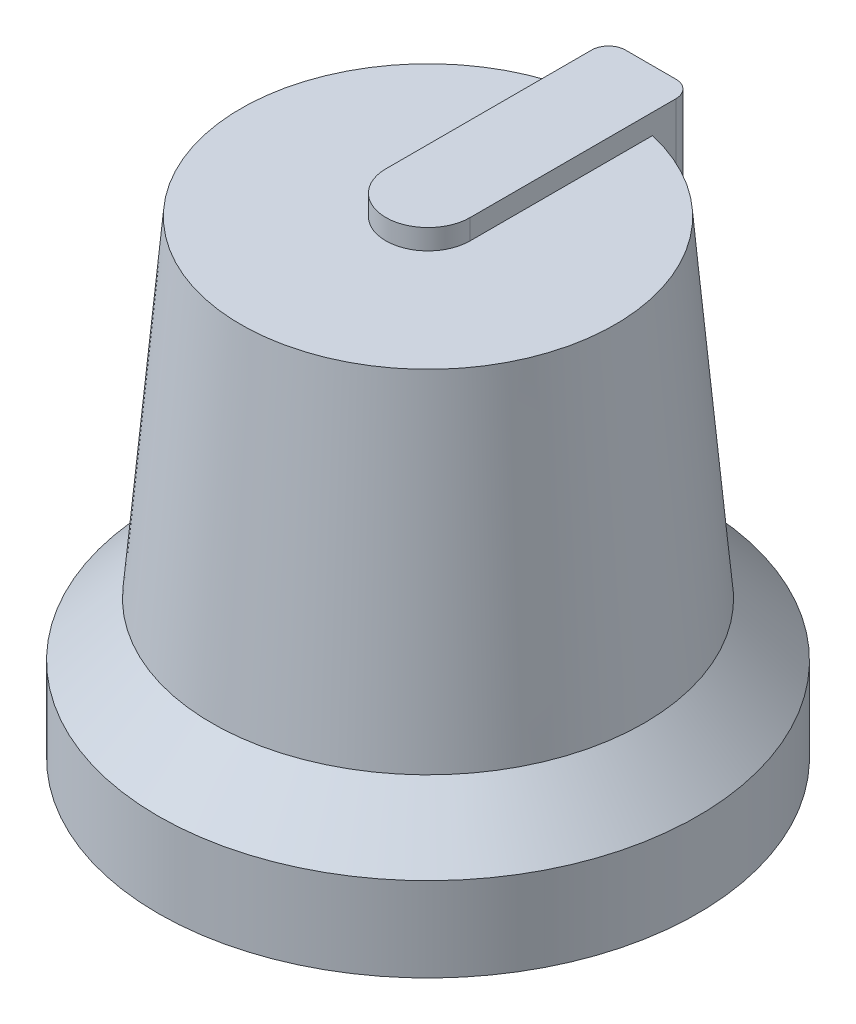
ISO-10303-21;
HEADER;
FILE_DESCRIPTION(('STEP AP214'),'2;1');
FILE_NAME('part.step','',(''),(''),'','','');
FILE_SCHEMA(('AUTOMOTIVE_DESIGN { 1 0 10303 214 1 1 1 1 }'));
ENDSEC;
DATA;
#1=APPLICATION_CONTEXT('core data for automotive mechanical design processes');
#2=APPLICATION_PROTOCOL_DEFINITION('international standard','automotive_design',2000,#1);
#3=PRODUCT_CONTEXT('',#1,'mechanical');
#4=PRODUCT('Part','Part','',(#3));
#5=PRODUCT_RELATED_PRODUCT_CATEGORY('part','',(#4));
#6=PRODUCT_DEFINITION_FORMATION('','',#4);
#7=PRODUCT_DEFINITION_CONTEXT('part definition',#1,'design');
#8=PRODUCT_DEFINITION('design','',#6,#7);
#9=PRODUCT_DEFINITION_SHAPE('','',#8);
#10=(LENGTH_UNIT() NAMED_UNIT(*) SI_UNIT(.MILLI.,.METRE.));
#11=(NAMED_UNIT(*) PLANE_ANGLE_UNIT() SI_UNIT($,.RADIAN.));
#12=(NAMED_UNIT(*) SI_UNIT($,.STERADIAN.) SOLID_ANGLE_UNIT());
#13=UNCERTAINTY_MEASURE_WITH_UNIT(LENGTH_MEASURE(1.E-05),#10,'distance_accuracy_value','');
#14=(GEOMETRIC_REPRESENTATION_CONTEXT(3) GLOBAL_UNCERTAINTY_ASSIGNED_CONTEXT((#13)) GLOBAL_UNIT_ASSIGNED_CONTEXT((#10,
#11,#12)) REPRESENTATION_CONTEXT('',''));
#15=CARTESIAN_POINT('',(0.,0.,0.));
#16=DIRECTION('',(0.,0.,1.));
#17=DIRECTION('',(1.,0.,0.));
#18=AXIS2_PLACEMENT_3D('',#15,#16,#17);
#19=CARTESIAN_POINT('',(0.,13.9,0.));
#20=DIRECTION('',(0.,1.,0.));
#21=DIRECTION('',(0.,0.,1.));
#22=AXIS2_PLACEMENT_3D('',#19,#20,#21);
#23=PLANE('',#22);
#24=CARTESIAN_POINT('',(0.,13.9,0.));
#25=DIRECTION('',(0.,-1.,0.));
#26=DIRECTION('',(0.,0.,-1.));
#27=AXIS2_PLACEMENT_3D('',#24,#25,#26);
#28=CIRCLE('',#27,5.55);
#29=CARTESIAN_POINT('',(1.25000004,13.9,-5.40740232459172));
#30=VERTEX_POINT('',#29);
#31=CARTESIAN_POINT('',(-1.25000004,13.9,-5.40740232459172));
#32=VERTEX_POINT('',#31);
#33=EDGE_CURVE('E11',#30,#32,#28,.T.);
#34=ORIENTED_EDGE('',*,*,#33,.F.);
#35=DIRECTION('',(0.,0.,-1.));
#36=VECTOR('',#35,1.);
#37=CARTESIAN_POINT('',(1.25000004,13.9,0.));
#38=LINE('',#37,#36);
#39=CARTESIAN_POINT('',(1.25000004,13.9,0.));
#40=VERTEX_POINT('',#39);
#41=EDGE_CURVE('E66',#40,#30,#38,.T.);
#42=ORIENTED_EDGE('',*,*,#41,.F.);
#43=CARTESIAN_POINT('',(0.,13.9,0.));
#44=DIRECTION('',(0.,1.,0.));
#45=DIRECTION('',(0.,0.,1.));
#46=AXIS2_PLACEMENT_3D('',#43,#44,#45);
#47=CIRCLE('',#46,1.25000004);
#48=CARTESIAN_POINT('',(-1.25000004,13.9,0.));
#49=VERTEX_POINT('',#48);
#50=EDGE_CURVE('E169',#49,#40,#47,.T.);
#51=ORIENTED_EDGE('',*,*,#50,.F.);
#52=DIRECTION('',(0.,0.,1.));
#53=VECTOR('',#52,1.);
#54=CARTESIAN_POINT('',(-1.25000004,13.9,-6.104));
#55=LINE('',#54,#53);
#56=EDGE_CURVE('E163',#32,#49,#55,.T.);
#57=ORIENTED_EDGE('',*,*,#56,.F.);
#58=EDGE_LOOP('',(#34,#42,#51,#57));
#59=FACE_BOUND('',#58,.T.);
#60=ADVANCED_FACE('F43',(#59),#23,.T.);
#61=CARTESIAN_POINT('',(0.,4.0919026731409,0.));
#62=DIRECTION('',(0.,-1.,0.));
#63=DIRECTION('',(0.,0.,-1.));
#64=AXIS2_PLACEMENT_3D('',#61,#62,#63);
#65=CONICAL_SURFACE('',#64,6.4080973268591,0.0872664625997172);
#66=CARTESIAN_POINT('',(1.13287773589336,2.75947851711593,-6.42556596521925));
#67=CARTESIAN_POINT('',(1.14010249654289,2.84208286496006,-6.41695324963921));
#68=CARTESIAN_POINT('',(1.14678798875751,2.92473970483003,-6.40841472831424));
#69=CARTESIAN_POINT('',(1.15923515555885,3.09013409168479,-6.39146939860238));
#70=CARTESIAN_POINT('',(1.16499685881051,3.17287163608516,-6.38306258613591));
#71=CARTESIAN_POINT('',(1.1811277455034,3.42115784202162,-6.35801579928834));
#72=CARTESIAN_POINT('',(1.19034427376621,3.58679881601859,-6.34154753027921));
#73=CARTESIAN_POINT('',(1.20385174246225,3.86554456774386,-6.31416718765233));
#74=CARTESIAN_POINT('',(1.20877708805953,3.97861011857928,-6.30315315834273));
#75=CARTESIAN_POINT('',(1.21973414088708,4.25748143967847,-6.27619321910208));
#76=CARTESIAN_POINT('',(1.22521230379919,4.42331823099242,-6.26034011202074));
#77=CARTESIAN_POINT('',(1.23441170376236,4.75507086490616,-6.22894607315379));
#78=CARTESIAN_POINT('',(1.23813291175039,4.92098670876817,-6.21340514653624));
#79=CARTESIAN_POINT('',(1.24721542557524,5.43188623262331,-6.16600191508051));
#80=CARTESIAN_POINT('',(1.25001555976719,5.77696136775237,-6.13461806319985));
#81=CARTESIAN_POINT('',(1.24998503059938,6.45411214251673,-6.07415123156932));
#82=CARTESIAN_POINT('',(1.24736397916437,6.78618424223582,-6.04502613216578));
#83=CARTESIAN_POINT('',(1.2410579221894,7.19716504213283,-6.009613143888));
#84=CARTESIAN_POINT('',(1.23970750086682,7.27607088336374,-6.00284293916313));
#85=CARTESIAN_POINT('',(1.23821914878362,7.35497634587432,-5.99610142809781));
#86=B_SPLINE_CURVE_WITH_KNOTS('',3,(#66,#67,#68,#69,#70,#71,#72,#73,#74,#75,#76,#77,#78,#79,#80,
#81,#82,#83,#84,#85),.UNSPECIFIED.,.F.,.F.,(4,2,2,2,2,2,2,2,2,4),(0.,0.250091906154019,
0.500176050514862,1.00028763288696,1.34140674154141,1.84144235656785,2.34148624275007,
3.38095651390291,4.38098734517701,4.61860858160698),.UNSPECIFIED.);
#87=CARTESIAN_POINT('',(1.21322843086549,4.0919026731409,-6.29220057889435));
#88=VERTEX_POINT('',#87);
#89=CARTESIAN_POINT('',(1.25000004,6.11984443019012,-6.104));
#90=VERTEX_POINT('',#89);
#91=EDGE_CURVE('E110',#88,#90,#86,.T.);
#92=ORIENTED_EDGE('',*,*,#91,.T.);
#93=CARTESIAN_POINT('',(1.25000004,-7.46068189339517,-7.31275277575942));
#94=CARTESIAN_POINT('',(1.25000004,-5.19490274002375,-7.11163661786975));
#95=CARTESIAN_POINT('',(1.25000004,-2.9291424416168,-6.91030739249945));
#96=CARTESIAN_POINT('',(1.25000004,1.60232336786873,-6.50703874465845));
#97=CARTESIAN_POINT('',(1.25000004,3.86802887895862,-6.30509932231488));
#98=CARTESIAN_POINT('',(1.25000004,7.74370757222152,-5.95898024591337));
#99=CARTESIAN_POINT('',(1.25000004,9.35369830843248,-5.81499720478357));
#100=CARTESIAN_POINT('',(1.25000004,12.5736345362197,-5.52652648435787));
#101=CARTESIAN_POINT('',(1.25000004,14.183580027797,-5.38203880507492));
#102=CARTESIAN_POINT('',(1.25000004,17.4034145159577,-5.09242958768715));
#103=CARTESIAN_POINT('',(1.25000004,19.0133035125242,-4.94730804939491));
#104=CARTESIAN_POINT('',(1.25000004,22.233005689752,-4.65622484605253));
#105=CARTESIAN_POINT('',(1.25000004,23.842818870406,-4.51026318092195));
#106=CARTESIAN_POINT('',(1.25000004,25.4525845665361,-4.3637783110485));
#107=B_SPLINE_CURVE_WITH_KNOTS('',3,(#93,#94,#95,#96,#97,#98,#99,#100,#101,#102,#103,#104,#105,
#106),.UNSPECIFIED.,.F.,.F.,(4,2,2,2,2,2,4),(0.,6.82406235427606,13.6481232869528,
18.4973717797254,23.3466201480801,28.1958699504224,33.0451202171295),.UNSPECIFIED.);
#108=EDGE_CURVE('E121',#90,#30,#107,.T.);
#109=ORIENTED_EDGE('',*,*,#108,.T.);
#110=ORIENTED_EDGE('',*,*,#33,.T.);
#111=CARTESIAN_POINT('',(-1.25000004,25.4525845665361,-4.36377831104848));
#112=CARTESIAN_POINT('',(-1.25000004,24.0665207363569,-4.48991148495176));
#113=CARTESIAN_POINT('',(-1.25000004,22.6804211764974,-4.61565114926747));
#114=CARTESIAN_POINT('',(-1.25000004,19.9081638711375,-4.86648469910314));
#115=CARTESIAN_POINT('',(-1.25000004,18.5220061256478,-4.99157858474114));
#116=CARTESIAN_POINT('',(-1.25000004,15.0862570318947,-5.30100766957549));
#117=CARTESIAN_POINT('',(-1.25000004,13.0366387463785,-5.48504366003264));
#118=CARTESIAN_POINT('',(-1.25000004,8.93732921856495,-5.85230200229592));
#119=CARTESIAN_POINT('',(-1.25000004,6.88763797626408,-6.03552435406263));
#120=CARTESIAN_POINT('',(-1.25000004,2.7881994345329,-6.40135378466173));
#121=CARTESIAN_POINT('',(-1.25000004,0.738452135071536,-6.58396086314601));
#122=CARTESIAN_POINT('',(-1.25000004,-3.36108547558575,-6.94868899243772));
#123=CARTESIAN_POINT('',(-1.25000004,-5.41087578677677,-7.13081004330028));
#124=CARTESIAN_POINT('',(-1.25000004,-7.46068189339517,-7.31275277575942));
#125=B_SPLINE_CURVE_WITH_KNOTS('',3,(#111,#112,#113,#114,#115,#116,#117,#118,#119,#120,#121,
#122,#123,#124),.UNSPECIFIED.,.F.,.F.,(4,2,2,2,2,2,4),(0.,4.17537318414044,8.35074560514845,
14.5243374636698,20.6979296211488,26.8715252709371,33.0451202203383),.UNSPECIFIED.);
#126=CARTESIAN_POINT('',(-1.25000004,6.11984443019012,-6.104));
#127=VERTEX_POINT('',#126);
#128=EDGE_CURVE('E173',#32,#127,#125,.T.);
#129=ORIENTED_EDGE('',*,*,#128,.T.);
#130=CARTESIAN_POINT('',(-1.23802538181554,7.36519706245983,-5.99522837792289));
#131=CARTESIAN_POINT('',(-1.2411805799537,7.19915773013139,-6.0094094258567));
#132=CARTESIAN_POINT('',(-1.24372597930049,7.03311696453166,-6.02371739176339));
#133=CARTESIAN_POINT('',(-1.24756470614474,6.70104499240537,-6.05259002861875));
#134=CARTESIAN_POINT('',(-1.24885804615077,6.53501378579988,-6.06715469700136));
#135=CARTESIAN_POINT('',(-1.24983192657511,6.28668684475427,-6.08913411614203));
#136=CARTESIAN_POINT('',(-1.24999686664072,6.2043840708151,-6.09645087032249));
#137=CARTESIAN_POINT('',(-1.25000632049041,5.95607166338285,-6.11862437839113));
#138=CARTESIAN_POINT('',(-1.24935425938871,5.79007049190831,-6.13358049069972));
#139=CARTESIAN_POINT('',(-1.24664644068078,5.45810155758846,-6.1637658293685));
#140=CARTESIAN_POINT('',(-1.24459065965172,5.29213379534684,-6.17899506028188));
#141=CARTESIAN_POINT('',(-1.23882946460056,4.9536993042354,-6.2103482909902));
#142=CARTESIAN_POINT('',(-1.23506212858186,4.78123467974333,-6.22648387916341));
#143=CARTESIAN_POINT('',(-1.22564209834689,4.43639368011715,-6.2590905109381));
#144=CARTESIAN_POINT('',(-1.21998947354061,4.26401730196806,-6.27556154216875));
#145=CARTESIAN_POINT('',(-1.20834966908922,3.96770489688132,-6.30420729408972));
#146=CARTESIAN_POINT('',(-1.20290072805375,3.84373909599984,-6.31629168411649));
#147=CARTESIAN_POINT('',(-1.19064712579009,3.59589821460663,-6.34067643934778));
#148=CARTESIAN_POINT('',(-1.18384249661927,3.47202313201924,-6.35297679943909));
#149=CARTESIAN_POINT('',(-1.16861132285913,3.22436595377569,-6.37782586285574));
#150=CARTESIAN_POINT('',(-1.1601844080915,3.100583885828,-6.39037462227417));
#151=CARTESIAN_POINT('',(-1.1412007396534,2.85320429384708,-6.41577416467707));
#152=CARTESIAN_POINT('',(-1.13064379278908,2.72960678757871,-6.42862497496406));
#153=CARTESIAN_POINT('',(-1.11876806400668,2.60614441218051,-6.44165388265235));
#154=B_SPLINE_CURVE_WITH_KNOTS('',3,(#130,#131,#132,#133,#134,#135,#136,#137,#138,#139,#140,
#141,#142,#143,#144,#145,#146,#147,#148,#149,#150,#151,#152,#153),.UNSPECIFIED.,.F.,.F.,(4,2,2,
2,2,2,2,2,2,2,2,4),(0.,0.50002111324739,1.00003723103632,1.24791939039897,1.74793763583056,
2.24796422489953,2.76773145054726,3.28747954222814,3.66149077982441,4.03549317438891,
4.40958101138377,4.78370279340043),.UNSPECIFIED.);
#155=CARTESIAN_POINT('',(-1.21322843086549,4.0919026731409,-6.29220057889435));
#156=VERTEX_POINT('',#155);
#157=EDGE_CURVE('E133',#127,#156,#154,.T.);
#158=ORIENTED_EDGE('',*,*,#157,.T.);
#159=CARTESIAN_POINT('',(0.,4.0919026731409,0.));
#160=DIRECTION('',(0.,-1.,0.));
#161=DIRECTION('',(0.,0.,-1.));
#162=AXIS2_PLACEMENT_3D('',#159,#160,#161);
#163=CIRCLE('',#162,6.4080973268591);
#164=EDGE_CURVE('E51',#88,#156,#163,.T.);
#165=ORIENTED_EDGE('',*,*,#164,.F.);
#166=EDGE_LOOP('',(#92,#109,#110,#129,#158,#165));
#167=FACE_BOUND('',#166,.T.);
#168=ADVANCED_FACE('F130',(#167),#65,.T.);
#169=CARTESIAN_POINT('',(0.,2.5,0.));
#170=DIRECTION('',(0.,-1.,0.));
#171=DIRECTION('',(0.,0.,-1.));
#172=AXIS2_PLACEMENT_3D('',#169,#170,#171);
#173=CONICAL_SURFACE('',#172,8.,0.78539816339745);
#174=CARTESIAN_POINT('',(0.,2.5,0.));
#175=DIRECTION('',(0.,-1.,0.));
#176=DIRECTION('',(0.,0.,-1.));
#177=AXIS2_PLACEMENT_3D('',#174,#175,#176);
#178=CIRCLE('',#177,8.);
#179=CARTESIAN_POINT('',(0.,2.5,-8.));
#180=VERTEX_POINT('',#179);
#181=EDGE_CURVE('E135',#180,#180,#178,.T.);
#182=ORIENTED_EDGE('',*,*,#181,.F.);
#183=EDGE_LOOP('',(#182));
#184=FACE_BOUND('',#183,.T.);
#185=CARTESIAN_POINT('',(-2.93747102475546,3.27216823512902,-6.604));
#186=CARTESIAN_POINT('',(-2.71795125581765,3.36140755181154,-6.604));
#187=CARTESIAN_POINT('',(-2.49525865593165,3.44354690804809,-6.604));
#188=CARTESIAN_POINT('',(-2.04352352433876,3.59035815083516,-6.604));
#189=CARTESIAN_POINT('',(-1.81446460908893,3.65497925203881,-6.604));
#190=CARTESIAN_POINT('',(-1.35340333148473,3.76243462515413,-6.604));
#191=CARTESIAN_POINT('',(-1.12144784455828,3.80546503853981,-6.604));
#192=CARTESIAN_POINT('',(-0.654581316224557,3.8676619860604,-6.604));
#193=CARTESIAN_POINT('',(-0.419674211314476,3.88685747207899,-6.604));
#194=CARTESIAN_POINT('',(0.0400518317789469,3.89969247957265,-6.604));
#195=CARTESIAN_POINT('',(0.264839106900688,3.89446417471271,-6.604));
#196=CARTESIAN_POINT('',(0.712824174808814,3.86140167248454,-6.604));
#197=CARTESIAN_POINT('',(0.936021144260654,3.83355651798973,-6.604));
#198=CARTESIAN_POINT('',(1.3785655556552,3.75717147849871,-6.604));
#199=CARTESIAN_POINT('',(1.5979162407188,3.70864999683234,-6.604));
#200=CARTESIAN_POINT('',(2.03185332391421,3.59366804334918,-6.604));
#201=CARTESIAN_POINT('',(2.24643885903217,3.52720435024642,-6.604));
#202=CARTESIAN_POINT('',(2.53904634768731,3.42512568379671,-6.604));
#203=CARTESIAN_POINT('',(2.61936002312391,3.395889746193,-6.604));
#204=CARTESIAN_POINT('',(2.77906217466537,3.33546539247429,-6.604));
#205=CARTESIAN_POINT('',(2.85845220862081,3.30428109732015,-6.604));
#206=CARTESIAN_POINT('',(2.93747102475546,3.27216823512903,-6.604));
#207=B_SPLINE_CURVE_WITH_KNOTS('',3,(#185,#186,#187,#188,#189,#190,#191,#192,#193,#194,#195,
#196,#197,#198,#199,#200,#201,#202,#203,#204,#205,#206),.UNSPECIFIED.,.F.,.F.,(4,2,2,2,2,2,2,2,
2,2,4),(0.,0.711172643449182,1.42438544592641,2.13099609603524,2.83674759581278,
3.51011708069701,4.18381298587064,4.85691050449505,5.53012894930884,5.78651920034542,
6.04238440615543),.UNSPECIFIED.);
#208=CARTESIAN_POINT('',(-0.75000004,3.85354861147694,-6.604));
#209=VERTEX_POINT('',#208);
#210=CARTESIAN_POINT('',(0.750000039999999,3.85354861147694,-6.604));
#211=VERTEX_POINT('',#210);
#212=EDGE_CURVE('E58',#209,#211,#207,.T.);
#213=ORIENTED_EDGE('',*,*,#212,.T.);
#214=CARTESIAN_POINT('',(0.749800040000003,3.85357121668606,-6.60399996));
#215=CARTESIAN_POINT('',(0.771403639773914,3.85109280117301,-6.60404598841703));
#216=CARTESIAN_POINT('',(0.793145856970375,3.84994955812903,-6.60261909741542));
#217=CARTESIAN_POINT('',(0.836136652965838,3.85026813995214,-6.59698877400453));
#218=CARTESIAN_POINT('',(0.857387199750065,3.85171655589465,-6.5927997035417));
#219=CARTESIAN_POINT('',(0.898858334722953,3.85712875301414,-6.58181204194323));
#220=CARTESIAN_POINT('',(0.919079017111683,3.86109230368774,-6.57501368996175));
#221=CARTESIAN_POINT('',(0.958011876585937,3.87127576649991,-6.55916259969556));
#222=CARTESIAN_POINT('',(0.976722932028446,3.87749733780205,-6.5501082052383));
#223=CARTESIAN_POINT('',(1.0129058053693,3.89211241963123,-6.52982313705048));
#224=CARTESIAN_POINT('',(1.03031580794177,3.90057121528838,-6.51853016014791));
#225=CARTESIAN_POINT('',(1.06303781517231,3.91918644654492,-6.4944118094291));
#226=CARTESIAN_POINT('',(1.07834799319306,3.92934434335839,-6.48158511936207));
#227=CARTESIAN_POINT('',(1.11452624918978,3.95687801646396,-6.44755036875907));
#228=CARTESIAN_POINT('',(1.13394063829663,3.97519264658931,-6.4255519031362));
#229=CARTESIAN_POINT('',(1.16794223027641,4.01408031339815,-6.37992947697517));
#230=CARTESIAN_POINT('',(1.18252439194279,4.03465567898536,-6.35630384973717));
#231=CARTESIAN_POINT('',(1.20169147260684,4.06782199986429,-6.318934245978));
#232=CARTESIAN_POINT('',(1.20783187133544,4.0798720747658,-6.30549245498137));
#233=CARTESIAN_POINT('',(1.2133181511385,4.0921026731409,-6.29197959434754));
#234=B_SPLINE_CURVE_WITH_KNOTS('',3,(#214,#215,#216,#217,#218,#219,#220,#221,#222,#223,#224,
#225,#226,#227,#228,#229,#230,#231,#232,#233),.UNSPECIFIED.,.F.,.F.,(4,2,2,2,2,2,2,2,2,4),(0.,
0.0651248662093497,0.129913758081904,0.194696713134586,0.259527366536472,0.326511666172871,
0.393553870795345,0.496740817246482,0.600035076728479,0.657169024109247),.UNSPECIFIED.);
#235=EDGE_CURVE('E114',#211,#88,#234,.T.);
#236=ORIENTED_EDGE('',*,*,#235,.T.);
#237=ORIENTED_EDGE('',*,*,#164,.T.);
#238=CARTESIAN_POINT('',(-1.21331815113849,4.0921026731409,-6.29197959434754));
#239=CARTESIAN_POINT('',(-1.20117955090898,4.06501682593485,-6.32189370062592));
#240=CARTESIAN_POINT('',(-1.18571741928667,4.03866366966739,-6.35165100659283));
#241=CARTESIAN_POINT('',(-1.14743509296658,3.9887561921137,-6.40939267626969));
#242=CARTESIAN_POINT('',(-1.12452871726425,3.96523930612167,-6.43735144017263));
#243=CARTESIAN_POINT('',(-1.08171476738121,3.93156360582252,-6.4787791242672));
#244=CARTESIAN_POINT('',(-1.06431729170213,3.91984026870809,-6.49354752155575));
#245=CARTESIAN_POINT('',(-1.02682236161323,3.89866213759605,-6.52102176733967));
#246=CARTESIAN_POINT('',(-1.00673546814882,3.8891988540999,-6.5337352745544));
#247=CARTESIAN_POINT('',(-0.963824420910882,3.87294466725876,-6.55663286013134));
#248=CARTESIAN_POINT('',(-0.940972122075718,3.86618489103581,-6.5667870049463));
#249=CARTESIAN_POINT('',(-0.893318946205508,3.85603356499613,-6.58368291176266));
#250=CARTESIAN_POINT('',(-0.868519852890792,3.85263896987301,-6.59042775628133));
#251=CARTESIAN_POINT('',(-0.827870438248322,3.85013614665026,-6.59814866936445));
#252=CARTESIAN_POINT('',(-0.812307218932988,3.84987173841274,-6.60034892083176));
#253=CARTESIAN_POINT('',(-0.781073351857723,3.85070271296177,-6.60328157545013));
#254=CARTESIAN_POINT('',(-0.765402666982556,3.85179859178542,-6.60401344289119));
#255=CARTESIAN_POINT('',(-0.749800040000003,3.85357121668606,-6.60399996));
#256=B_SPLINE_CURVE_WITH_KNOTS('',3,(#238,#239,#240,#241,#242,#243,#244,#245,#246,#247,#248,
#249,#250,#251,#252,#253,#254,#255),.UNSPECIFIED.,.F.,.F.,(4,2,2,2,2,2,2,2,4),(0.,
0.126907200267646,0.255339299416598,0.332026437401409,0.408420815797515,0.485671059931894,
0.5628513327948,0.60989287552072,0.656951577277139),.UNSPECIFIED.);
#257=EDGE_CURVE('E214',#156,#209,#256,.T.);
#258=ORIENTED_EDGE('',*,*,#257,.T.);
#259=EDGE_LOOP('',(#213,#236,#237,#258));
#260=FACE_BOUND('',#259,.T.);
#261=ADVANCED_FACE('F125',(#184,#260),#173,.T.);
#262=CARTESIAN_POINT('',(0.,0.,0.));
#263=DIRECTION('',(0.,-1.,0.));
#264=DIRECTION('',(0.,0.,-1.));
#265=AXIS2_PLACEMENT_3D('',#262,#263,#264);
#266=CYLINDRICAL_SURFACE('',#265,8.);
#267=ORIENTED_EDGE('',*,*,#181,.T.);
#268=EDGE_LOOP('',(#267));
#269=FACE_BOUND('',#268,.T.);
#270=CARTESIAN_POINT('',(0.,0.,0.));
#271=DIRECTION('',(0.,-1.,0.));
#272=DIRECTION('',(0.,0.,-1.));
#273=AXIS2_PLACEMENT_3D('',#270,#271,#272);
#274=CIRCLE('',#273,8.);
#275=CARTESIAN_POINT('',(0.,0.,-8.));
#276=VERTEX_POINT('',#275);
#277=EDGE_CURVE('E138',#276,#276,#274,.T.);
#278=ORIENTED_EDGE('',*,*,#277,.F.);
#279=EDGE_LOOP('',(#278));
#280=FACE_BOUND('',#279,.T.);
#281=ADVANCED_FACE('F310',(#269,#280),#266,.T.);
#282=CARTESIAN_POINT('',(8.,0.,0.));
#283=DIRECTION('',(0.,-1.,0.));
#284=DIRECTION('',(0.,0.,-1.));
#285=AXIS2_PLACEMENT_3D('',#282,#283,#284);
#286=PLANE('',#285);
#287=CARTESIAN_POINT('',(0.,0.,0.));
#288=DIRECTION('',(0.,1.,0.));
#289=DIRECTION('',(0.,0.,1.));
#290=AXIS2_PLACEMENT_3D('',#287,#288,#289);
#291=CIRCLE('',#290,3.);
#292=CARTESIAN_POINT('',(0.,0.,3.));
#293=VERTEX_POINT('',#292);
#294=EDGE_CURVE('E223',#293,#293,#291,.T.);
#295=ORIENTED_EDGE('',*,*,#294,.T.);
#296=EDGE_LOOP('',(#295));
#297=FACE_BOUND('',#296,.T.);
#298=ORIENTED_EDGE('',*,*,#277,.T.);
#299=EDGE_LOOP('',(#298));
#300=FACE_BOUND('',#299,.T.);
#301=ADVANCED_FACE('F261',(#297,#300),#286,.T.);
#302=CARTESIAN_POINT('',(0.,14.5,0.));
#303=DIRECTION('',(0.,-1.,0.));
#304=DIRECTION('',(0.,0.,-1.));
#305=AXIS2_PLACEMENT_3D('',#302,#303,#304);
#306=CYLINDRICAL_SURFACE('',#305,1.25000004);
#307=ORIENTED_EDGE('',*,*,#50,.T.);
#308=DIRECTION('',(0.,-1.,0.));
#309=VECTOR('',#308,1.);
#310=CARTESIAN_POINT('',(1.25000004,14.5,0.));
#311=LINE('',#310,#309);
#312=CARTESIAN_POINT('',(1.25000004,14.5,0.));
#313=VERTEX_POINT('',#312);
#314=EDGE_CURVE('E144',#313,#40,#311,.T.);
#315=ORIENTED_EDGE('',*,*,#314,.F.);
#316=CARTESIAN_POINT('',(0.,14.5,0.));
#317=DIRECTION('',(0.,1.,0.));
#318=DIRECTION('',(0.,0.,1.));
#319=AXIS2_PLACEMENT_3D('',#316,#317,#318);
#320=CIRCLE('',#319,1.25000004);
#321=CARTESIAN_POINT('',(-1.25000004,14.5,0.));
#322=VERTEX_POINT('',#321);
#323=EDGE_CURVE('E166',#322,#313,#320,.T.);
#324=ORIENTED_EDGE('',*,*,#323,.F.);
#325=DIRECTION('',(0.,-1.,0.));
#326=VECTOR('',#325,1.);
#327=CARTESIAN_POINT('',(-1.25000004,14.5,0.));
#328=LINE('',#327,#326);
#329=EDGE_CURVE('E158',#322,#49,#328,.T.);
#330=ORIENTED_EDGE('',*,*,#329,.T.);
#331=EDGE_LOOP('',(#307,#315,#324,#330));
#332=FACE_BOUND('',#331,.T.);
#333=ADVANCED_FACE('F297',(#332),#306,.T.);
#334=CARTESIAN_POINT('',(1.25000004,14.5,0.));
#335=DIRECTION('',(-1.,0.,0.));
#336=DIRECTION('',(0.,0.,1.));
#337=AXIS2_PLACEMENT_3D('',#334,#335,#336);
#338=PLANE('',#337);
#339=ORIENTED_EDGE('',*,*,#41,.T.);
#340=ORIENTED_EDGE('',*,*,#108,.F.);
#341=DIRECTION('',(0.,-1.,0.));
#342=VECTOR('',#341,1.);
#343=CARTESIAN_POINT('',(1.25000004,14.5,-6.104));
#344=LINE('',#343,#342);
#345=CARTESIAN_POINT('',(1.25000004,14.5,-6.104));
#346=VERTEX_POINT('',#345);
#347=EDGE_CURVE('E117',#346,#90,#344,.T.);
#348=ORIENTED_EDGE('',*,*,#347,.F.);
#349=DIRECTION('',(0.,0.,-1.));
#350=VECTOR('',#349,1.);
#351=CARTESIAN_POINT('',(1.25000004,14.5,0.));
#352=LINE('',#351,#350);
#353=EDGE_CURVE('E185',#313,#346,#352,.T.);
#354=ORIENTED_EDGE('',*,*,#353,.F.);
#355=ORIENTED_EDGE('',*,*,#314,.T.);
#356=EDGE_LOOP('',(#339,#340,#348,#354,#355));
#357=FACE_BOUND('',#356,.T.);
#358=ADVANCED_FACE('F295',(#357),#338,.F.);
#359=CARTESIAN_POINT('',(0.750000039999999,14.5,-6.104));
#360=DIRECTION('',(0.,-1.,0.));
#361=DIRECTION('',(0.,0.,-1.));
#362=AXIS2_PLACEMENT_3D('',#359,#360,#361);
#363=CYLINDRICAL_SURFACE('',#362,0.5);
#364=ORIENTED_EDGE('',*,*,#347,.T.);
#365=ORIENTED_EDGE('',*,*,#91,.F.);
#366=ORIENTED_EDGE('',*,*,#235,.F.);
#367=DIRECTION('',(0.,-1.,0.));
#368=VECTOR('',#367,1.);
#369=CARTESIAN_POINT('',(0.750000039999999,14.5,-6.604));
#370=LINE('',#369,#368);
#371=CARTESIAN_POINT('',(0.750000039999999,14.5,-6.604));
#372=VERTEX_POINT('',#371);
#373=EDGE_CURVE('E149',#372,#211,#370,.T.);
#374=ORIENTED_EDGE('',*,*,#373,.F.);
#375=CARTESIAN_POINT('',(0.750000039999999,14.5,-6.104));
#376=DIRECTION('',(0.,1.,0.));
#377=DIRECTION('',(0.,0.,1.));
#378=AXIS2_PLACEMENT_3D('',#375,#376,#377);
#379=CIRCLE('',#378,0.5);
#380=EDGE_CURVE('E182',#346,#372,#379,.T.);
#381=ORIENTED_EDGE('',*,*,#380,.F.);
#382=EDGE_LOOP('',(#364,#365,#366,#374,#381));
#383=FACE_BOUND('',#382,.T.);
#384=ADVANCED_FACE('F112',(#383),#363,.T.);
#385=CARTESIAN_POINT('',(-0.750000039999999,14.5,-6.604));
#386=DIRECTION('',(0.,0.,1.));
#387=DIRECTION('',(1.,0.,0.));
#388=AXIS2_PLACEMENT_3D('',#385,#386,#387);
#389=PLANE('',#388);
#390=ORIENTED_EDGE('',*,*,#373,.T.);
#391=ORIENTED_EDGE('',*,*,#212,.F.);
#392=DIRECTION('',(0.,-1.,0.));
#393=VECTOR('',#392,1.);
#394=CARTESIAN_POINT('',(-0.750000039999999,14.5,-6.604));
#395=LINE('',#394,#393);
#396=CARTESIAN_POINT('',(-0.750000039999999,14.5,-6.604));
#397=VERTEX_POINT('',#396);
#398=EDGE_CURVE('E152',#397,#209,#395,.T.);
#399=ORIENTED_EDGE('',*,*,#398,.F.);
#400=DIRECTION('',(-1.,0.,0.));
#401=VECTOR('',#400,1.);
#402=CARTESIAN_POINT('',(-0.750000039999999,14.5,-6.604));
#403=LINE('',#402,#401);
#404=EDGE_CURVE('E179',#372,#397,#403,.T.);
#405=ORIENTED_EDGE('',*,*,#404,.F.);
#406=EDGE_LOOP('',(#390,#391,#399,#405));
#407=FACE_BOUND('',#406,.T.);
#408=ADVANCED_FACE('F292',(#407),#389,.F.);
#409=CARTESIAN_POINT('',(-0.750000039999999,14.5,-6.104));
#410=DIRECTION('',(0.,-1.,0.));
#411=DIRECTION('',(0.,0.,-1.));
#412=AXIS2_PLACEMENT_3D('',#409,#410,#411);
#413=CYLINDRICAL_SURFACE('',#412,0.5);
#414=ORIENTED_EDGE('',*,*,#398,.T.);
#415=ORIENTED_EDGE('',*,*,#257,.F.);
#416=ORIENTED_EDGE('',*,*,#157,.F.);
#417=DIRECTION('',(0.,-1.,0.));
#418=VECTOR('',#417,1.);
#419=CARTESIAN_POINT('',(-1.25000004,14.5,-6.104));
#420=LINE('',#419,#418);
#421=CARTESIAN_POINT('',(-1.25000004,14.5,-6.104));
#422=VERTEX_POINT('',#421);
#423=EDGE_CURVE('E155',#422,#127,#420,.T.);
#424=ORIENTED_EDGE('',*,*,#423,.F.);
#425=CARTESIAN_POINT('',(-0.750000039999999,14.5,-6.104));
#426=DIRECTION('',(0.,1.,0.));
#427=DIRECTION('',(0.,0.,-1.));
#428=AXIS2_PLACEMENT_3D('',#425,#426,#427);
#429=CIRCLE('',#428,0.5);
#430=EDGE_CURVE('E176',#397,#422,#429,.T.);
#431=ORIENTED_EDGE('',*,*,#430,.F.);
#432=EDGE_LOOP('',(#414,#415,#416,#424,#431));
#433=FACE_BOUND('',#432,.T.);
#434=ADVANCED_FACE('F290',(#433),#413,.T.);
#435=CARTESIAN_POINT('',(-1.25000004,14.5,-6.104));
#436=DIRECTION('',(1.,0.,0.));
#437=DIRECTION('',(0.,0.,-1.));
#438=AXIS2_PLACEMENT_3D('',#435,#436,#437);
#439=PLANE('',#438);
#440=ORIENTED_EDGE('',*,*,#423,.T.);
#441=ORIENTED_EDGE('',*,*,#128,.F.);
#442=ORIENTED_EDGE('',*,*,#56,.T.);
#443=ORIENTED_EDGE('',*,*,#329,.F.);
#444=DIRECTION('',(0.,0.,1.));
#445=VECTOR('',#444,1.);
#446=CARTESIAN_POINT('',(-1.25000004,14.5,-6.104));
#447=LINE('',#446,#445);
#448=EDGE_CURVE('E162',#422,#322,#447,.T.);
#449=ORIENTED_EDGE('',*,*,#448,.F.);
#450=EDGE_LOOP('',(#440,#441,#442,#443,#449));
#451=FACE_BOUND('',#450,.T.);
#452=ADVANCED_FACE('F273',(#451),#439,.F.);
#453=CARTESIAN_POINT('',(0.,14.5,0.));
#454=DIRECTION('',(0.,1.,0.));
#455=DIRECTION('',(0.,0.,1.));
#456=AXIS2_PLACEMENT_3D('',#453,#454,#455);
#457=PLANE('',#456);
#458=ORIENTED_EDGE('',*,*,#323,.T.);
#459=ORIENTED_EDGE('',*,*,#353,.T.);
#460=ORIENTED_EDGE('',*,*,#380,.T.);
#461=ORIENTED_EDGE('',*,*,#404,.T.);
#462=ORIENTED_EDGE('',*,*,#430,.T.);
#463=ORIENTED_EDGE('',*,*,#448,.T.);
#464=EDGE_LOOP('',(#458,#459,#460,#461,#462,#463));
#465=FACE_BOUND('',#464,.T.);
#466=ADVANCED_FACE('F209',(#465),#457,.T.);
#467=CARTESIAN_POINT('',(0.,12.,0.));
#468=DIRECTION('',(0.,-1.,0.));
#469=DIRECTION('',(0.,0.,-1.));
#470=AXIS2_PLACEMENT_3D('',#467,#468,#469);
#471=CYLINDRICAL_SURFACE('',#470,3.);
#472=CARTESIAN_POINT('',(0.,12.,0.));
#473=DIRECTION('',(0.,1.,0.));
#474=DIRECTION('',(0.,0.,1.));
#475=AXIS2_PLACEMENT_3D('',#472,#473,#474);
#476=CIRCLE('',#475,3.);
#477=CARTESIAN_POINT('',(0.,12.,3.));
#478=VERTEX_POINT('',#477);
#479=EDGE_CURVE('E250',#478,#478,#476,.T.);
#480=ORIENTED_EDGE('',*,*,#479,.T.);
#481=EDGE_LOOP('',(#480));
#482=FACE_BOUND('',#481,.T.);
#483=ORIENTED_EDGE('',*,*,#294,.F.);
#484=EDGE_LOOP('',(#483));
#485=FACE_BOUND('',#484,.T.);
#486=ADVANCED_FACE('F264',(#482,#485),#471,.F.);
#487=CARTESIAN_POINT('',(0.,12.,0.));
#488=DIRECTION('',(0.,1.,0.));
#489=DIRECTION('',(0.,0.,1.));
#490=AXIS2_PLACEMENT_3D('',#487,#488,#489);
#491=PLANE('',#490);
#492=ORIENTED_EDGE('',*,*,#479,.F.);
#493=EDGE_LOOP('',(#492));
#494=FACE_BOUND('',#493,.T.);
#495=ADVANCED_FACE('F266',(#494),#491,.F.);
#496=CLOSED_SHELL('',(#60,#168,#261,#281,#301,#333,#358,#384,#408,#434,#452,#466,#486,#495));
#497=MANIFOLD_SOLID_BREP('B2',#496);
#498=ADVANCED_BREP_SHAPE_REPRESENTATION('',(#18,#497),#14);
#499=SHAPE_DEFINITION_REPRESENTATION(#9,#498);
ENDSEC;
END-ISO-10303-21;
